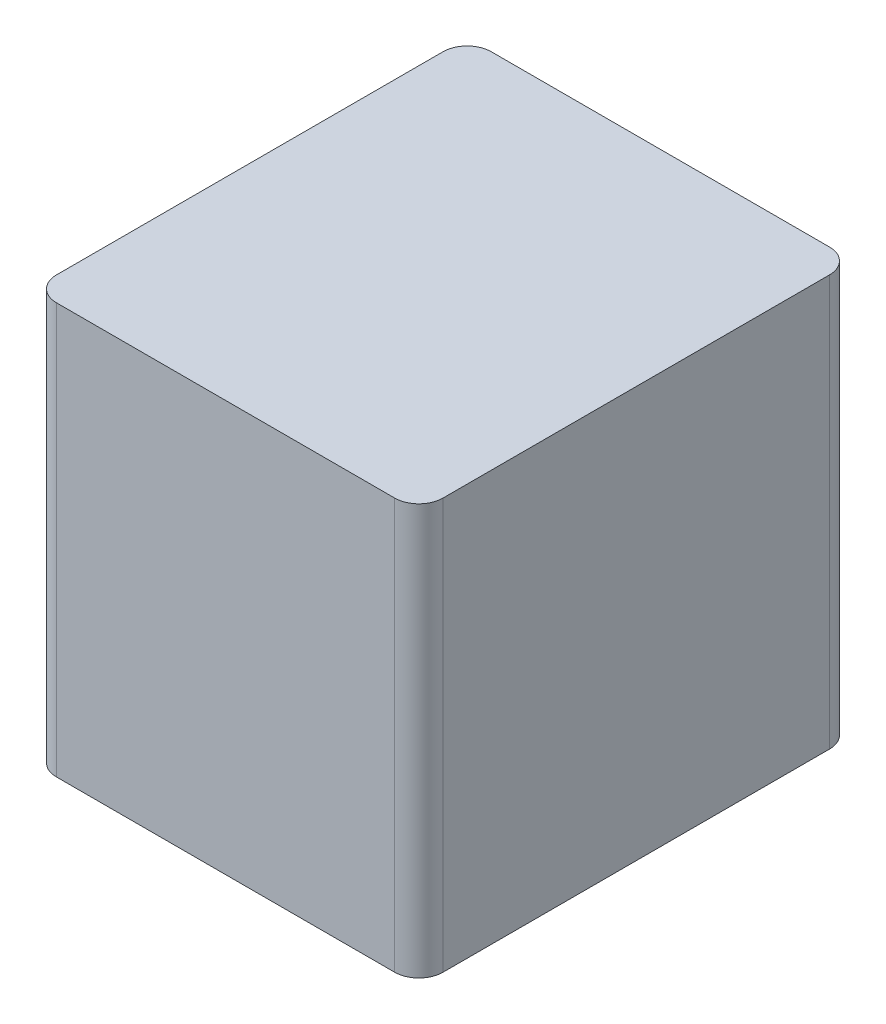
ISO-10303-21;
HEADER;
FILE_DESCRIPTION(('STEP AP214'),'2;1');
FILE_NAME('part.step','',(''),(''),'','','');
FILE_SCHEMA(('AUTOMOTIVE_DESIGN { 1 0 10303 214 1 1 1 1 }'));
ENDSEC;
DATA;
#1=APPLICATION_CONTEXT('core data for automotive mechanical design processes');
#2=APPLICATION_PROTOCOL_DEFINITION('international standard','automotive_design',2000,#1);
#3=PRODUCT_CONTEXT('',#1,'mechanical');
#4=PRODUCT('Part','Part','',(#3));
#5=PRODUCT_RELATED_PRODUCT_CATEGORY('part','',(#4));
#6=PRODUCT_DEFINITION_FORMATION('','',#4);
#7=PRODUCT_DEFINITION_CONTEXT('part definition',#1,'design');
#8=PRODUCT_DEFINITION('design','',#6,#7);
#9=PRODUCT_DEFINITION_SHAPE('','',#8);
#10=(LENGTH_UNIT() NAMED_UNIT(*) SI_UNIT(.MILLI.,.METRE.));
#11=(NAMED_UNIT(*) PLANE_ANGLE_UNIT() SI_UNIT($,.RADIAN.));
#12=(NAMED_UNIT(*) SI_UNIT($,.STERADIAN.) SOLID_ANGLE_UNIT());
#13=UNCERTAINTY_MEASURE_WITH_UNIT(LENGTH_MEASURE(1.E-05),#10,'distance_accuracy_value','');
#14=(GEOMETRIC_REPRESENTATION_CONTEXT(3) GLOBAL_UNCERTAINTY_ASSIGNED_CONTEXT((#13)) GLOBAL_UNIT_ASSIGNED_CONTEXT((#10,
#11,#12)) REPRESENTATION_CONTEXT('',''));
#15=CARTESIAN_POINT('',(0.,0.,0.));
#16=DIRECTION('',(0.,0.,1.));
#17=DIRECTION('',(1.,0.,0.));
#18=AXIS2_PLACEMENT_3D('',#15,#16,#17);
#19=CARTESIAN_POINT('',(18.993926847021,10.893927981953,0.45));
#20=DIRECTION('',(1.19248806982E-08,-1.,0.));
#21=DIRECTION('',(1.,1.19248806982E-08,0.));
#22=AXIS2_PLACEMENT_3D('',#19,#20,#21);
#23=PLANE('',#22);
#24=CARTESIAN_POINT('',(19.3439268470211,10.8939279861268,0.05));
#25=DIRECTION('',(-1.19248806982E-08,1.,0.));
#26=DIRECTION('',(-1.,-1.19248806982E-08,0.));
#27=AXIS2_PLACEMENT_3D('',#24,#25,#26);
#28=CIRCLE('',#27,0.05);
#29=CARTESIAN_POINT('',(19.3939268470211,10.893927986723,0.0499999999999998));
#30=VERTEX_POINT('',#29);
#31=CARTESIAN_POINT('',(19.343926841953,10.8939279861269,0.));
#32=VERTEX_POINT('',#31);
#33=EDGE_CURVE('E126',#30,#32,#28,.T.);
#34=ORIENTED_EDGE('',*,*,#33,.F.);
#35=DIRECTION('',(0.,0.,1.));
#36=VECTOR('',#35,1.);
#37=CARTESIAN_POINT('',(19.3939268470211,10.893927986723,0.85));
#38=LINE('',#37,#36);
#39=CARTESIAN_POINT('',(19.3939268470211,10.8939279867231,0.85));
#40=VERTEX_POINT('',#39);
#41=EDGE_CURVE('E102',#40,#30,#38,.F.);
#42=ORIENTED_EDGE('',*,*,#41,.F.);
#43=CARTESIAN_POINT('',(19.3439268470211,10.893927986127,0.85));
#44=DIRECTION('',(-1.19248806982E-08,1.,0.));
#45=DIRECTION('',(-1.,-1.19248806982E-08,0.));
#46=AXIS2_PLACEMENT_3D('',#43,#44,#45);
#47=CIRCLE('',#46,0.05);
#48=CARTESIAN_POINT('',(19.3439268470211,10.893927981953,0.9));
#49=VERTEX_POINT('',#48);
#50=EDGE_CURVE('E82',#49,#40,#47,.T.);
#51=ORIENTED_EDGE('',*,*,#50,.F.);
#52=DIRECTION('',(1.,0.,0.));
#53=VECTOR('',#52,1.);
#54=CARTESIAN_POINT('',(18.643926841953,10.893927977779,0.9));
#55=LINE('',#54,#53);
#56=CARTESIAN_POINT('',(18.643926841953,10.8939279777791,0.9));
#57=VERTEX_POINT('',#56);
#58=EDGE_CURVE('E81',#57,#49,#55,.T.);
#59=ORIENTED_EDGE('',*,*,#58,.F.);
#60=CARTESIAN_POINT('',(18.6439268470211,10.8939279777792,0.85));
#61=DIRECTION('',(-1.19248806982E-08,1.,0.));
#62=DIRECTION('',(-1.,-1.19248806982E-08,0.));
#63=AXIS2_PLACEMENT_3D('',#60,#61,#62);
#64=CIRCLE('',#63,0.05);
#65=CARTESIAN_POINT('',(18.5939268470211,10.893927977183,0.85));
#66=VERTEX_POINT('',#65);
#67=EDGE_CURVE('E20',#66,#57,#64,.T.);
#68=ORIENTED_EDGE('',*,*,#67,.F.);
#69=DIRECTION('',(0.,0.,1.));
#70=VECTOR('',#69,1.);
#71=CARTESIAN_POINT('',(18.5939268470211,10.893927977183,0.05));
#72=LINE('',#71,#70);
#73=CARTESIAN_POINT('',(18.5939268470211,10.8939279771829,0.05));
#74=VERTEX_POINT('',#73);
#75=EDGE_CURVE('E111',#74,#66,#72,.T.);
#76=ORIENTED_EDGE('',*,*,#75,.F.);
#77=CARTESIAN_POINT('',(18.6439268470211,10.893927977779,0.05));
#78=DIRECTION('',(-1.19248806982E-08,1.,0.));
#79=DIRECTION('',(-1.,-1.19248806982E-08,0.));
#80=AXIS2_PLACEMENT_3D('',#77,#78,#79);
#81=CIRCLE('',#80,0.05);
#82=CARTESIAN_POINT('',(18.6439268470211,10.893927981953,0.));
#83=VERTEX_POINT('',#82);
#84=EDGE_CURVE('E128',#83,#74,#81,.T.);
#85=ORIENTED_EDGE('',*,*,#84,.F.);
#86=DIRECTION('',(-1.,0.,0.));
#87=VECTOR('',#86,1.);
#88=CARTESIAN_POINT('',(19.343926841953,10.893927986127,0.));
#89=LINE('',#88,#87);
#90=EDGE_CURVE('E106',#32,#83,#89,.T.);
#91=ORIENTED_EDGE('',*,*,#90,.F.);
#92=EDGE_LOOP('',(#34,#42,#51,#59,#68,#76,#85,#91));
#93=FACE_BOUND('',#92,.T.);
#94=ADVANCED_FACE('F17',(#93),#23,.T.);
#95=CARTESIAN_POINT('',(18.643926841953,11.318927977779,0.9));
#96=DIRECTION('',(0.,0.,1.));
#97=DIRECTION('',(0.,-1.,0.));
#98=AXIS2_PLACEMENT_3D('',#95,#96,#97);
#99=PLANE('',#98);
#100=DIRECTION('',(-1.19248806982E-08,1.,0.));
#101=VECTOR('',#100,1.);
#102=CARTESIAN_POINT('',(18.6439268419529,11.318927977779,0.9));
#103=LINE('',#102,#101);
#104=CARTESIAN_POINT('',(18.6439268368849,11.7439279777791,0.9));
#105=VERTEX_POINT('',#104);
#106=EDGE_CURVE('E87',#57,#105,#103,.T.);
#107=ORIENTED_EDGE('',*,*,#106,.F.);
#108=ORIENTED_EDGE('',*,*,#58,.T.);
#109=DIRECTION('',(-1.19248806982E-08,1.,0.));
#110=VECTOR('',#109,1.);
#111=CARTESIAN_POINT('',(19.3439268419531,11.318927986127,0.9));
#112=LINE('',#111,#110);
#113=CARTESIAN_POINT('',(19.343926836885,11.7439279861267,0.9));
#114=VERTEX_POINT('',#113);
#115=EDGE_CURVE('E125',#114,#49,#112,.F.);
#116=ORIENTED_EDGE('',*,*,#115,.F.);
#117=DIRECTION('',(1.,1.19248806982E-08,0.));
#118=VECTOR('',#117,1.);
#119=CARTESIAN_POINT('',(18.993926836885,11.743927981953,0.9));
#120=LINE('',#119,#118);
#121=EDGE_CURVE('E97',#114,#105,#120,.F.);
#122=ORIENTED_EDGE('',*,*,#121,.T.);
#123=EDGE_LOOP('',(#107,#108,#116,#122));
#124=FACE_BOUND('',#123,.T.);
#125=ADVANCED_FACE('F96',(#124),#99,.T.);
#126=CARTESIAN_POINT('',(18.643926841953,11.318927977779,0.85));
#127=DIRECTION('',(-1.19248806982E-08,1.,0.));
#128=DIRECTION('',(-1.,-1.19248806982E-08,0.));
#129=AXIS2_PLACEMENT_3D('',#126,#127,#128);
#130=CYLINDRICAL_SURFACE('',#129,0.05);
#131=DIRECTION('',(1.19248806982E-08,-1.,0.));
#132=VECTOR('',#131,1.);
#133=CARTESIAN_POINT('',(18.593926841953,11.318927977183,0.85));
#134=LINE('',#133,#132);
#135=CARTESIAN_POINT('',(18.593926836885,11.7439279771829,0.85));
#136=VERTEX_POINT('',#135);
#137=EDGE_CURVE('E94',#66,#136,#134,.F.);
#138=ORIENTED_EDGE('',*,*,#137,.F.);
#139=ORIENTED_EDGE('',*,*,#67,.T.);
#140=ORIENTED_EDGE('',*,*,#106,.T.);
#141=CARTESIAN_POINT('',(18.6439268368849,11.743927977779,0.85));
#142=DIRECTION('',(-1.19248806982E-08,1.,0.));
#143=DIRECTION('',(-1.,-1.19248806982E-08,0.));
#144=AXIS2_PLACEMENT_3D('',#141,#142,#143);
#145=CIRCLE('',#144,0.05);
#146=EDGE_CURVE('E122',#105,#136,#145,.F.);
#147=ORIENTED_EDGE('',*,*,#146,.T.);
#148=EDGE_LOOP('',(#138,#139,#140,#147));
#149=FACE_BOUND('',#148,.T.);
#150=ADVANCED_FACE('F91',(#149),#130,.T.);
#151=CARTESIAN_POINT('',(18.593926841953,11.318927977183,0.05));
#152=DIRECTION('',(-1.,-1.19248806982E-08,0.));
#153=DIRECTION('',(1.19248806982E-08,-1.,0.));
#154=AXIS2_PLACEMENT_3D('',#151,#152,#153);
#155=PLANE('',#154);
#156=DIRECTION('',(-1.19248806982E-08,1.,0.));
#157=VECTOR('',#156,1.);
#158=CARTESIAN_POINT('',(18.593926841953,11.3189279771828,0.05));
#159=LINE('',#158,#157);
#160=CARTESIAN_POINT('',(18.593926836885,11.743927977183,0.0500000000000001));
#161=VERTEX_POINT('',#160);
#162=EDGE_CURVE('E112',#74,#161,#159,.T.);
#163=ORIENTED_EDGE('',*,*,#162,.F.);
#164=ORIENTED_EDGE('',*,*,#75,.T.);
#165=ORIENTED_EDGE('',*,*,#137,.T.);
#166=DIRECTION('',(0.,0.,1.));
#167=VECTOR('',#166,1.);
#168=CARTESIAN_POINT('',(18.593926836885,11.743927977183,0.45));
#169=LINE('',#168,#167);
#170=EDGE_CURVE('E121',#136,#161,#169,.F.);
#171=ORIENTED_EDGE('',*,*,#170,.T.);
#172=EDGE_LOOP('',(#163,#164,#165,#171));
#173=FACE_BOUND('',#172,.T.);
#174=ADVANCED_FACE('F162',(#173),#155,.T.);
#175=CARTESIAN_POINT('',(18.643926841953,11.318927977779,0.05));
#176=DIRECTION('',(-1.19248806982E-08,1.,0.));
#177=DIRECTION('',(-1.,-1.19248806982E-08,0.));
#178=AXIS2_PLACEMENT_3D('',#175,#176,#177);
#179=CYLINDRICAL_SURFACE('',#178,0.05);
#180=DIRECTION('',(0.,1.,0.));
#181=VECTOR('',#180,1.);
#182=CARTESIAN_POINT('',(18.643926847021,11.318927986127,0.));
#183=LINE('',#182,#181);
#184=CARTESIAN_POINT('',(18.643926841953,11.7439279777793,0.));
#185=VERTEX_POINT('',#184);
#186=EDGE_CURVE('E110',#83,#185,#183,.T.);
#187=ORIENTED_EDGE('',*,*,#186,.F.);
#188=ORIENTED_EDGE('',*,*,#84,.T.);
#189=ORIENTED_EDGE('',*,*,#162,.T.);
#190=CARTESIAN_POINT('',(18.6439268368849,11.7439279777792,0.0500000000000001));
#191=DIRECTION('',(-1.19248806982E-08,1.,0.));
#192=DIRECTION('',(-1.,-1.19248806982E-08,0.));
#193=AXIS2_PLACEMENT_3D('',#190,#191,#192);
#194=CIRCLE('',#193,0.05);
#195=EDGE_CURVE('E118',#161,#185,#194,.F.);
#196=ORIENTED_EDGE('',*,*,#195,.T.);
#197=EDGE_LOOP('',(#187,#188,#189,#196));
#198=FACE_BOUND('',#197,.T.);
#199=ADVANCED_FACE('F160',(#198),#179,.T.);
#200=CARTESIAN_POINT('',(19.343926841953,11.318927986127,0.));
#201=DIRECTION('',(0.,0.,-1.));
#202=DIRECTION('',(-1.,0.,0.));
#203=AXIS2_PLACEMENT_3D('',#200,#201,#202);
#204=PLANE('',#203);
#205=DIRECTION('',(-1.19248806982E-08,1.,0.));
#206=VECTOR('',#205,1.);
#207=CARTESIAN_POINT('',(19.3439268419529,11.318927986127,0.));
#208=LINE('',#207,#206);
#209=CARTESIAN_POINT('',(19.3439268368849,11.7439279861269,0.));
#210=VERTEX_POINT('',#209);
#211=EDGE_CURVE('E109',#32,#210,#208,.T.);
#212=ORIENTED_EDGE('',*,*,#211,.F.);
#213=ORIENTED_EDGE('',*,*,#90,.T.);
#214=ORIENTED_EDGE('',*,*,#186,.T.);
#215=DIRECTION('',(1.,1.19248806982E-08,0.));
#216=VECTOR('',#215,1.);
#217=CARTESIAN_POINT('',(18.993926836885,11.743927981953,0.));
#218=LINE('',#217,#216);
#219=EDGE_CURVE('E117',#185,#210,#218,.T.);
#220=ORIENTED_EDGE('',*,*,#219,.T.);
#221=EDGE_LOOP('',(#212,#213,#214,#220));
#222=FACE_BOUND('',#221,.T.);
#223=ADVANCED_FACE('F158',(#222),#204,.T.);
#224=CARTESIAN_POINT('',(19.343926841953,11.318927986127,0.05));
#225=DIRECTION('',(-1.19248806982E-08,1.,0.));
#226=DIRECTION('',(-1.,-1.19248806982E-08,0.));
#227=AXIS2_PLACEMENT_3D('',#224,#225,#226);
#228=CYLINDRICAL_SURFACE('',#227,0.05);
#229=DIRECTION('',(-1.19248806982E-08,1.,0.));
#230=VECTOR('',#229,1.);
#231=CARTESIAN_POINT('',(19.393926841953,11.318927986723,0.0499999999999996));
#232=LINE('',#231,#230);
#233=CARTESIAN_POINT('',(19.393926836885,11.7439279867231,0.0499999999999998));
#234=VERTEX_POINT('',#233);
#235=EDGE_CURVE('E105',#30,#234,#232,.T.);
#236=ORIENTED_EDGE('',*,*,#235,.F.);
#237=ORIENTED_EDGE('',*,*,#33,.T.);
#238=ORIENTED_EDGE('',*,*,#211,.T.);
#239=CARTESIAN_POINT('',(19.3439268368849,11.743927986127,0.0500000000000001));
#240=DIRECTION('',(-1.19248806982E-08,1.,0.));
#241=DIRECTION('',(-1.,-1.19248806982E-08,0.));
#242=AXIS2_PLACEMENT_3D('',#239,#240,#241);
#243=CIRCLE('',#242,0.05);
#244=EDGE_CURVE('E114',#210,#234,#243,.F.);
#245=ORIENTED_EDGE('',*,*,#244,.T.);
#246=EDGE_LOOP('',(#236,#237,#238,#245));
#247=FACE_BOUND('',#246,.T.);
#248=ADVANCED_FACE('F155',(#247),#228,.T.);
#249=CARTESIAN_POINT('',(19.393926841953,11.318927986723,0.85));
#250=DIRECTION('',(1.,1.19248806982E-08,0.));
#251=DIRECTION('',(-1.19248806982E-08,1.,0.));
#252=AXIS2_PLACEMENT_3D('',#249,#250,#251);
#253=PLANE('',#252);
#254=DIRECTION('',(-1.19248806982E-08,1.,0.));
#255=VECTOR('',#254,1.);
#256=CARTESIAN_POINT('',(19.393926841953,11.3189279867232,0.85));
#257=LINE('',#256,#255);
#258=CARTESIAN_POINT('',(19.393926836885,11.743927986723,0.85));
#259=VERTEX_POINT('',#258);
#260=EDGE_CURVE('E34',#40,#259,#257,.T.);
#261=ORIENTED_EDGE('',*,*,#260,.F.);
#262=ORIENTED_EDGE('',*,*,#41,.T.);
#263=ORIENTED_EDGE('',*,*,#235,.T.);
#264=DIRECTION('',(0.,0.,1.));
#265=VECTOR('',#264,1.);
#266=CARTESIAN_POINT('',(19.393926836885,11.743927986723,0.45));
#267=LINE('',#266,#265);
#268=EDGE_CURVE('E26',#234,#259,#267,.T.);
#269=ORIENTED_EDGE('',*,*,#268,.T.);
#270=EDGE_LOOP('',(#261,#262,#263,#269));
#271=FACE_BOUND('',#270,.T.);
#272=ADVANCED_FACE('F148',(#271),#253,.T.);
#273=CARTESIAN_POINT('',(19.343926841953,11.318927986127,0.85));
#274=DIRECTION('',(-1.19248806982E-08,1.,0.));
#275=DIRECTION('',(-1.,-1.19248806982E-08,0.));
#276=AXIS2_PLACEMENT_3D('',#273,#274,#275);
#277=CYLINDRICAL_SURFACE('',#276,0.05);
#278=ORIENTED_EDGE('',*,*,#115,.T.);
#279=ORIENTED_EDGE('',*,*,#50,.T.);
#280=ORIENTED_EDGE('',*,*,#260,.T.);
#281=CARTESIAN_POINT('',(19.3439268368849,11.7439279861268,0.85));
#282=DIRECTION('',(-1.19248806982E-08,1.,0.));
#283=DIRECTION('',(-1.,-1.19248806982E-08,0.));
#284=AXIS2_PLACEMENT_3D('',#281,#282,#283);
#285=CIRCLE('',#284,0.05);
#286=EDGE_CURVE('E11',#259,#114,#285,.F.);
#287=ORIENTED_EDGE('',*,*,#286,.T.);
#288=EDGE_LOOP('',(#278,#279,#280,#287));
#289=FACE_BOUND('',#288,.T.);
#290=ADVANCED_FACE('F173',(#289),#277,.T.);
#291=CARTESIAN_POINT('',(18.993926836885,11.743927981953,0.45));
#292=DIRECTION('',(1.19248806982E-08,-1.,0.));
#293=DIRECTION('',(1.,1.19248806982E-08,0.));
#294=AXIS2_PLACEMENT_3D('',#291,#292,#293);
#295=PLANE('',#294);
#296=ORIENTED_EDGE('',*,*,#268,.F.);
#297=ORIENTED_EDGE('',*,*,#244,.F.);
#298=ORIENTED_EDGE('',*,*,#219,.F.);
#299=ORIENTED_EDGE('',*,*,#195,.F.);
#300=ORIENTED_EDGE('',*,*,#170,.F.);
#301=ORIENTED_EDGE('',*,*,#146,.F.);
#302=ORIENTED_EDGE('',*,*,#121,.F.);
#303=ORIENTED_EDGE('',*,*,#286,.F.);
#304=EDGE_LOOP('',(#296,#297,#298,#299,#300,#301,#302,#303));
#305=FACE_BOUND('',#304,.T.);
#306=ADVANCED_FACE('F152',(#305),#295,.F.);
#307=CLOSED_SHELL('',(#94,#125,#150,#174,#199,#223,#248,#272,#290,#306));
#308=MANIFOLD_SOLID_BREP('B1',#307);
#309=ADVANCED_BREP_SHAPE_REPRESENTATION('',(#18,#308),#14);
#310=SHAPE_DEFINITION_REPRESENTATION(#9,#309);
ENDSEC;
END-ISO-10303-21;
